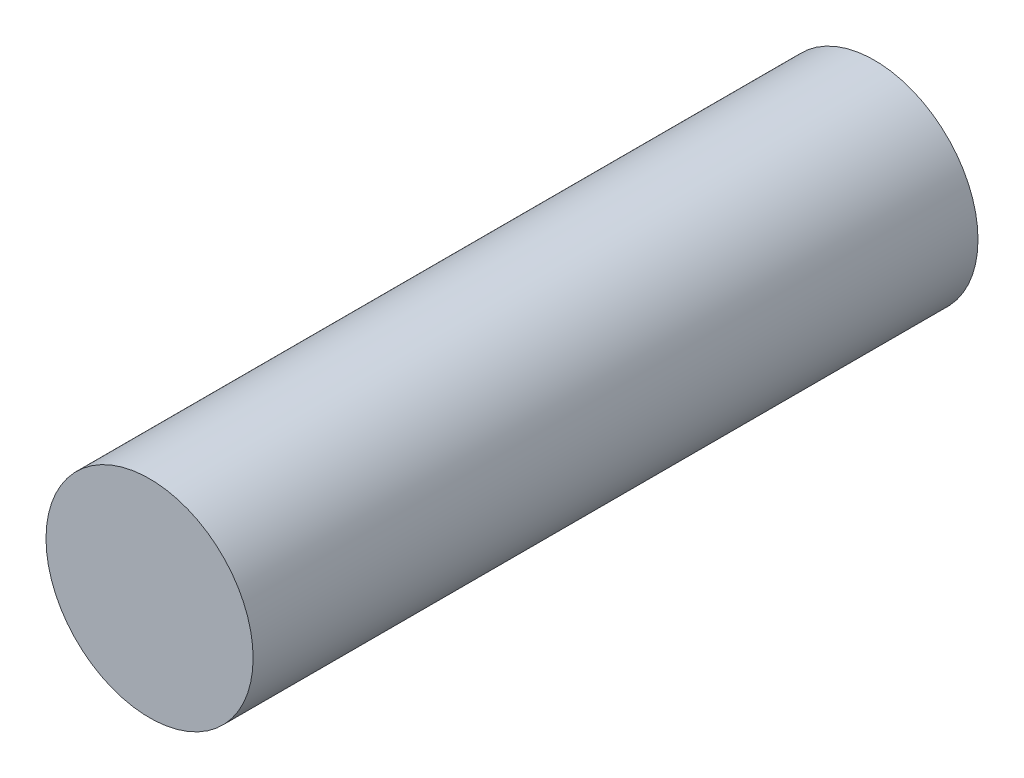
ISO-10303-21;
HEADER;
FILE_DESCRIPTION(('STEP AP214'),'2;1');
FILE_NAME('part.step','',(''),(''),'','','');
FILE_SCHEMA(('AUTOMOTIVE_DESIGN { 1 0 10303 214 1 1 1 1 }'));
ENDSEC;
DATA;
#1=APPLICATION_CONTEXT('core data for automotive mechanical design processes');
#2=APPLICATION_PROTOCOL_DEFINITION('international standard','automotive_design',2000,#1);
#3=PRODUCT_CONTEXT('',#1,'mechanical');
#4=PRODUCT('Part','Part','',(#3));
#5=PRODUCT_RELATED_PRODUCT_CATEGORY('part','',(#4));
#6=PRODUCT_DEFINITION_FORMATION('','',#4);
#7=PRODUCT_DEFINITION_CONTEXT('part definition',#1,'design');
#8=PRODUCT_DEFINITION('design','',#6,#7);
#9=PRODUCT_DEFINITION_SHAPE('','',#8);
#10=(LENGTH_UNIT() NAMED_UNIT(*) SI_UNIT(.MILLI.,.METRE.));
#11=(NAMED_UNIT(*) PLANE_ANGLE_UNIT() SI_UNIT($,.RADIAN.));
#12=(NAMED_UNIT(*) SI_UNIT($,.STERADIAN.) SOLID_ANGLE_UNIT());
#13=UNCERTAINTY_MEASURE_WITH_UNIT(LENGTH_MEASURE(1.E-05),#10,'distance_accuracy_value','');
#14=(GEOMETRIC_REPRESENTATION_CONTEXT(3) GLOBAL_UNCERTAINTY_ASSIGNED_CONTEXT((#13)) GLOBAL_UNIT_ASSIGNED_CONTEXT((#10,
#11,#12)) REPRESENTATION_CONTEXT('',''));
#15=CARTESIAN_POINT('',(0.,0.,0.));
#16=DIRECTION('',(0.,0.,1.));
#17=DIRECTION('',(1.,0.,0.));
#18=AXIS2_PLACEMENT_3D('',#15,#16,#17);
#19=CARTESIAN_POINT('',(0.,0.,11.1125));
#20=DIRECTION('',(0.,0.,-1.));
#21=DIRECTION('',(-1.,0.,0.));
#22=AXIS2_PLACEMENT_3D('',#19,#20,#21);
#23=CYLINDRICAL_SURFACE('',#22,3.175);
#24=CARTESIAN_POINT('',(0.,0.,11.1125));
#25=DIRECTION('',(0.,0.,1.));
#26=DIRECTION('',(1.,0.,0.));
#27=AXIS2_PLACEMENT_3D('',#24,#25,#26);
#28=CIRCLE('',#27,3.175);
#29=CARTESIAN_POINT('',(3.175,0.,11.1125));
#30=VERTEX_POINT('',#29);
#31=EDGE_CURVE('E10',#30,#30,#28,.T.);
#32=ORIENTED_EDGE('',*,*,#31,.F.);
#33=EDGE_LOOP('',(#32));
#34=FACE_BOUND('',#33,.T.);
#35=CARTESIAN_POINT('',(0.,0.,-11.1125));
#36=DIRECTION('',(0.,0.,1.));
#37=DIRECTION('',(1.,0.,0.));
#38=AXIS2_PLACEMENT_3D('',#35,#36,#37);
#39=CIRCLE('',#38,3.175);
#40=CARTESIAN_POINT('',(3.175,0.,-11.1125));
#41=VERTEX_POINT('',#40);
#42=EDGE_CURVE('E38',#41,#41,#39,.T.);
#43=ORIENTED_EDGE('',*,*,#42,.T.);
#44=EDGE_LOOP('',(#43));
#45=FACE_BOUND('',#44,.T.);
#46=ADVANCED_FACE('F35',(#34,#45),#23,.T.);
#47=CARTESIAN_POINT('',(0.,0.,11.1125));
#48=DIRECTION('',(0.,0.,1.));
#49=DIRECTION('',(1.,0.,0.));
#50=AXIS2_PLACEMENT_3D('',#47,#48,#49);
#51=PLANE('',#50);
#52=ORIENTED_EDGE('',*,*,#31,.T.);
#53=EDGE_LOOP('',(#52));
#54=FACE_BOUND('',#53,.T.);
#55=ADVANCED_FACE('F50',(#54),#51,.T.);
#56=CARTESIAN_POINT('',(0.,0.,-11.1125));
#57=DIRECTION('',(0.,0.,1.));
#58=DIRECTION('',(1.,0.,0.));
#59=AXIS2_PLACEMENT_3D('',#56,#57,#58);
#60=PLANE('',#59);
#61=ORIENTED_EDGE('',*,*,#42,.F.);
#62=EDGE_LOOP('',(#61));
#63=FACE_BOUND('',#62,.T.);
#64=ADVANCED_FACE('F48',(#63),#60,.F.);
#65=CLOSED_SHELL('',(#46,#55,#64));
#66=MANIFOLD_SOLID_BREP('B2',#65);
#67=ADVANCED_BREP_SHAPE_REPRESENTATION('',(#18,#66),#14);
#68=SHAPE_DEFINITION_REPRESENTATION(#9,#67);
ENDSEC;
END-ISO-10303-21;
